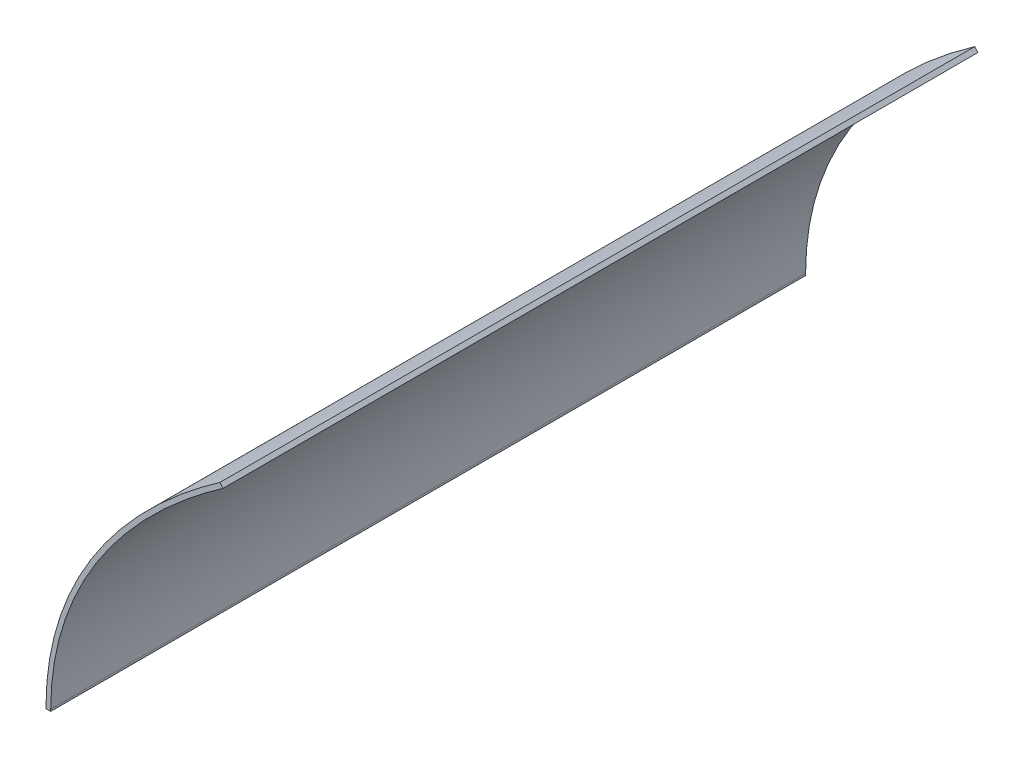
ISO-10303-21;
HEADER;
FILE_DESCRIPTION(('STEP AP214'),'2;1');
FILE_NAME('part.step','',(''),(''),'','','');
FILE_SCHEMA(('AUTOMOTIVE_DESIGN { 1 0 10303 214 1 1 1 1 }'));
ENDSEC;
DATA;
#1=APPLICATION_CONTEXT('core data for automotive mechanical design processes');
#2=APPLICATION_PROTOCOL_DEFINITION('international standard','automotive_design',2000,#1);
#3=PRODUCT_CONTEXT('',#1,'mechanical');
#4=PRODUCT('Part','Part','',(#3));
#5=PRODUCT_RELATED_PRODUCT_CATEGORY('part','',(#4));
#6=PRODUCT_DEFINITION_FORMATION('','',#4);
#7=PRODUCT_DEFINITION_CONTEXT('part definition',#1,'design');
#8=PRODUCT_DEFINITION('design','',#6,#7);
#9=PRODUCT_DEFINITION_SHAPE('','',#8);
#10=(LENGTH_UNIT() NAMED_UNIT(*) SI_UNIT(.MILLI.,.METRE.));
#11=(NAMED_UNIT(*) PLANE_ANGLE_UNIT() SI_UNIT($,.RADIAN.));
#12=(NAMED_UNIT(*) SI_UNIT($,.STERADIAN.) SOLID_ANGLE_UNIT());
#13=UNCERTAINTY_MEASURE_WITH_UNIT(LENGTH_MEASURE(1.E-05),#10,'distance_accuracy_value','');
#14=(GEOMETRIC_REPRESENTATION_CONTEXT(3) GLOBAL_UNCERTAINTY_ASSIGNED_CONTEXT((#13)) GLOBAL_UNIT_ASSIGNED_CONTEXT((#10,
#11,#12)) REPRESENTATION_CONTEXT('',''));
#15=CARTESIAN_POINT('',(0.,0.,0.));
#16=DIRECTION('',(0.,0.,1.));
#17=DIRECTION('',(1.,0.,0.));
#18=AXIS2_PLACEMENT_3D('',#15,#16,#17);
#19=CARTESIAN_POINT('',(-320.2,-39.4576678157257,0.));
#20=DIRECTION('',(1.,0.,0.));
#21=DIRECTION('',(0.,0.,-1.));
#22=AXIS2_PLACEMENT_3D('',#19,#20,#21);
#23=PLANE('',#22);
#24=DIRECTION('',(0.,1.,0.));
#25=VECTOR('',#24,1.);
#26=CARTESIAN_POINT('',(-320.2,-39.4576678157257,-40.));
#27=LINE('',#26,#25);
#28=CARTESIAN_POINT('',(-320.2,-39.6781588042974,-40.));
#29=VERTEX_POINT('',#28);
#30=CARTESIAN_POINT('',(-320.2,-39.4576678157257,-40.));
#31=VERTEX_POINT('',#30);
#32=EDGE_CURVE('E84',#29,#31,#27,.T.);
#33=ORIENTED_EDGE('',*,*,#32,.T.);
#34=DIRECTION('',(0.,0.,-1.));
#35=VECTOR('',#34,1.);
#36=CARTESIAN_POINT('',(-320.2,-39.4576678157257,0.));
#37=LINE('',#36,#35);
#38=CARTESIAN_POINT('',(-320.2,-39.4576678157257,40.));
#39=VERTEX_POINT('',#38);
#40=EDGE_CURVE('E126',#39,#31,#37,.T.);
#41=ORIENTED_EDGE('',*,*,#40,.F.);
#42=DIRECTION('',(0.,1.,0.));
#43=VECTOR('',#42,1.);
#44=CARTESIAN_POINT('',(-320.2,-39.4576678157257,40.));
#45=LINE('',#44,#43);
#46=CARTESIAN_POINT('',(-320.2,-39.6781588042974,40.));
#47=VERTEX_POINT('',#46);
#48=EDGE_CURVE('E69',#39,#47,#45,.F.);
#49=ORIENTED_EDGE('',*,*,#48,.T.);
#50=DIRECTION('',(0.,0.,-1.));
#51=VECTOR('',#50,1.);
#52=CARTESIAN_POINT('',(-320.2,-39.6781588042974,0.));
#53=LINE('',#52,#51);
#54=EDGE_CURVE('E129',#29,#47,#53,.F.);
#55=ORIENTED_EDGE('',*,*,#54,.F.);
#56=EDGE_LOOP('',(#33,#41,#49,#55));
#57=FACE_BOUND('',#56,.T.);
#58=ADVANCED_FACE('F16',(#57),#23,.T.);
#59=CARTESIAN_POINT('',(-320.2,-39.4576678157257,-40.));
#60=CARTESIAN_POINT('',(-320.2,-85.2653356314496,-40.));
#61=CARTESIAN_POINT('',(-241.755077106186,-85.26533563145,-40.));
#62=CARTESIAN_POINT('',(-163.310154212373,-85.2653356314504,-40.));
#63=CARTESIAN_POINT('',(-163.310154212372,-39.4576678157265,-40.));
#64=CARTESIAN_POINT('',(-163.310154212372,6.3499999999974,-40.));
#65=CARTESIAN_POINT('',(-241.755077106186,6.34999999999782,-40.));
#66=CARTESIAN_POINT('',(-320.2,6.34999999999822,-40.));
#67=CARTESIAN_POINT('',(-320.2,-39.4576678157257,-40.));
#68=CARTESIAN_POINT('',(-320.2,-39.4576678157257,40.));
#69=CARTESIAN_POINT('',(-320.2,-85.2653356314496,40.));
#70=CARTESIAN_POINT('',(-241.755077106186,-85.26533563145,40.));
#71=CARTESIAN_POINT('',(-163.310154212373,-85.2653356314504,40.));
#72=CARTESIAN_POINT('',(-163.310154212372,-39.4576678157265,40.));
#73=CARTESIAN_POINT('',(-163.310154212372,6.3499999999974,40.));
#74=CARTESIAN_POINT('',(-241.755077106186,6.34999999999782,40.));
#75=CARTESIAN_POINT('',(-320.2,6.34999999999822,40.));
#76=CARTESIAN_POINT('',(-320.2,-39.4576678157257,40.));
#77=(BOUNDED_SURFACE() B_SPLINE_SURFACE(1,2,((#59,#60,#61,#62,#63,#64,#65,#66,#67),(#68,#69,#70,
#71,#72,#73,#74,#75,#76)),.UNSPECIFIED.,.F.,.T.,.F.) B_SPLINE_SURFACE_WITH_KNOTS((2,2),(3,2,2,2,
3),(-0.509911904103031,0.509911904103031),(0.,123.220996737312,246.441993474623,
369.662990211935,492.883986949246),
.UNSPECIFIED.) GEOMETRIC_REPRESENTATION_ITEM() RATIONAL_B_SPLINE_SURFACE(((1.,0.707106781186548,
1.,0.707106781186548,1.,0.707106781186548,1.,0.707106781186548,1.),(1.,0.707106781186548,1.,
0.707106781186548,1.,0.707106781186548,1.,0.707106781186548,1.))) REPRESENTATION_ITEM('') SURFACE());
#78=CARTESIAN_POINT('',(-320.2,-39.4576678157257,-40.));
#79=CARTESIAN_POINT('',(-320.200001992337,-39.1844112710812,-40.));
#80=CARTESIAN_POINT('',(-320.195812234918,-38.9111722553848,-40.));
#81=CARTESIAN_POINT('',(-320.179072818182,-38.3649537047736,-40.));
#82=CARTESIAN_POINT('',(-320.166523261873,-38.0919741667031,-40.));
#83=CARTESIAN_POINT('',(-320.116402939818,-37.2742864870677,-40.));
#84=CARTESIAN_POINT('',(-320.066360416398,-36.7302922119212,-40.));
#85=CARTESIAN_POINT('',(-319.933563683254,-35.6465166187128,-40.));
#86=CARTESIAN_POINT('',(-319.850818885317,-35.1067341340282,-40.));
#87=CARTESIAN_POINT('',(-319.65485647069,-34.0404206264634,-40.));
#88=CARTESIAN_POINT('',(-319.54207425831,-33.5138094858131,-40.));
#89=CARTESIAN_POINT('',(-319.286639533193,-32.4678111790419,-40.));
#90=CARTESIAN_POINT('',(-319.143982261983,-31.9484251778058,-40.));
#91=CARTESIAN_POINT('',(-318.830128751372,-30.9183571387043,-40.));
#92=CARTESIAN_POINT('',(-318.658932019524,-30.4076752511954,-40.));
#93=CARTESIAN_POINT('',(-318.290120690814,-29.3979762876672,-40.));
#94=CARTESIAN_POINT('',(-318.092600066827,-28.8989248128179,-40.));
#95=CARTESIAN_POINT('',(-317.67224833539,-27.9116356233702,-40.));
#96=CARTESIAN_POINT('',(-317.449417963317,-27.4233975950787,-40.));
#97=CARTESIAN_POINT('',(-316.980047260997,-26.4584869818901,-40.));
#98=CARTESIAN_POINT('',(-316.733507354427,-25.9818141905191,-40.));
#99=CARTESIAN_POINT('',(-316.216371048529,-25.0370363744681,-40.));
#100=CARTESIAN_POINT('',(-315.945606997137,-24.5690232691788,-40.));
#101=CARTESIAN_POINT('',(-315.383243071798,-23.6457148713179,-40.));
#102=CARTESIAN_POINT('',(-315.091643482039,-23.1904194054011,-40.));
#103=CARTESIAN_POINT('',(-314.48916009879,-22.2928018067949,-40.));
#104=CARTESIAN_POINT('',(-314.178276298334,-21.8504796787926,-40.));
#105=CARTESIAN_POINT('',(-313.447928469511,-20.855248680115,-40.));
#106=CARTESIAN_POINT('',(-313.022685385304,-20.3065741094589,-40.));
#107=CARTESIAN_POINT('',(-312.145574528061,-19.230626042805,-40.));
#108=CARTESIAN_POINT('',(-311.693695718641,-18.7033615729834,-40.));
#109=CARTESIAN_POINT('',(-310.765768888456,-17.6698795445431,-40.));
#110=CARTESIAN_POINT('',(-310.289703240731,-17.1636778393313,-40.));
#111=CARTESIAN_POINT('',(-309.315793045927,-16.1720637105231,-40.));
#112=CARTESIAN_POINT('',(-308.817934386438,-15.6866651732835,-40.));
#113=CARTESIAN_POINT('',(-307.810573366755,-14.7437476522865,-40.));
#114=CARTESIAN_POINT('',(-307.30136142618,-14.2859178275346,-40.));
#115=CARTESIAN_POINT('',(-306.266285620308,-13.3900431945307,-40.));
#116=CARTESIAN_POINT('',(-305.740430148421,-12.9519886756497,-40.));
#117=CARTESIAN_POINT('',(-304.674274164163,-12.0955249579675,-40.));
#118=CARTESIAN_POINT('',(-304.133996338934,-11.6770874640828,-40.));
#119=CARTESIAN_POINT('',(-303.041157891734,-10.8597224408857,-40.));
#120=CARTESIAN_POINT('',(-302.488634626675,-10.4607449962774,-40.));
#121=CARTESIAN_POINT('',(-301.929970842398,-10.0706429067517,-40.));
#122=B_SPLINE_CURVE_WITH_KNOTS('',3,(#78,#79,#80,#81,#82,#83,#84,#85,#86,#87,#88,#89,#90,#91,
#92,#93,#94,#95,#96,#97,#98,#99,#100,#101,#102,#103,#104,#105,#106,#107,#108,#109,#110,#111,
#112,#113,#114,#115,#116,#117,#118,#119,#120,#121),.UNSPECIFIED.,.F.,.F.,(4,2,2,2,2,2,2,2,2,2,2,
2,2,2,2,2,2,2,2,2,2,4),(0.,0.819702712082179,1.63939532397697,3.27717207442907,4.91447781201449,
6.52923264478224,8.14424487008595,9.75928496517606,11.3687067421327,12.9780817691668,
14.5874280428937,16.208931128728,17.830412102183,19.4518936614372,21.5334721926057,
23.6159193628712,25.6999065864064,27.7852638926385,29.8390477164266,31.8918118122254,
33.9415177281154,35.9856551085407),.UNSPECIFIED.);
#123=CARTESIAN_POINT('',(-301.929970842398,-10.0706429067517,-40.));
#124=VERTEX_POINT('',#123);
#125=EDGE_CURVE('E86',#31,#124,#122,.T.);
#126=DIRECTION('',(0.,0.,1.));
#127=VECTOR('',#126,1.);
#128=CARTESIAN_POINT('',(-301.929970842398,-10.0706429067516,0.));
#129=LINE('',#128,#127);
#130=CARTESIAN_POINT('',(-301.929970842398,-10.0706429067517,40.));
#131=VERTEX_POINT('',#130);
#132=EDGE_CURVE('E87',#131,#124,#129,.F.);
#133=CARTESIAN_POINT('',(-320.2,-39.4576678157257,40.));
#134=CARTESIAN_POINT('',(-320.200001992337,-39.1844112710812,40.));
#135=CARTESIAN_POINT('',(-320.195812234918,-38.9111722553848,40.));
#136=CARTESIAN_POINT('',(-320.179072818182,-38.3649537047736,40.));
#137=CARTESIAN_POINT('',(-320.166523261873,-38.0919741667031,40.));
#138=CARTESIAN_POINT('',(-320.116402939818,-37.2742864870677,40.));
#139=CARTESIAN_POINT('',(-320.066360416398,-36.7302922119212,40.));
#140=CARTESIAN_POINT('',(-319.933563683254,-35.6465166187128,40.));
#141=CARTESIAN_POINT('',(-319.850818885317,-35.1067341340282,40.));
#142=CARTESIAN_POINT('',(-319.65485647069,-34.0404206264634,40.));
#143=CARTESIAN_POINT('',(-319.54207425831,-33.5138094858131,40.));
#144=CARTESIAN_POINT('',(-319.286639533193,-32.4678111790419,40.));
#145=CARTESIAN_POINT('',(-319.143982261983,-31.9484251778058,40.));
#146=CARTESIAN_POINT('',(-318.830128751372,-30.9183571387043,40.));
#147=CARTESIAN_POINT('',(-318.658932019524,-30.4076752511954,40.));
#148=CARTESIAN_POINT('',(-318.290120690814,-29.3979762876672,40.));
#149=CARTESIAN_POINT('',(-318.092600066827,-28.8989248128179,40.));
#150=CARTESIAN_POINT('',(-317.67224833539,-27.9116356233702,40.));
#151=CARTESIAN_POINT('',(-317.449417963317,-27.4233975950787,40.));
#152=CARTESIAN_POINT('',(-316.980047260997,-26.4584869818901,40.));
#153=CARTESIAN_POINT('',(-316.733507354427,-25.9818141905191,40.));
#154=CARTESIAN_POINT('',(-316.216371048529,-25.0370363744681,40.));
#155=CARTESIAN_POINT('',(-315.945606997137,-24.5690232691788,40.));
#156=CARTESIAN_POINT('',(-315.383243071798,-23.6457148713179,40.));
#157=CARTESIAN_POINT('',(-315.091643482039,-23.1904194054011,40.));
#158=CARTESIAN_POINT('',(-314.48916009879,-22.2928018067949,40.));
#159=CARTESIAN_POINT('',(-314.178276298334,-21.8504796787926,40.));
#160=CARTESIAN_POINT('',(-313.447928469511,-20.855248680115,40.));
#161=CARTESIAN_POINT('',(-313.022685385304,-20.3065741094589,40.));
#162=CARTESIAN_POINT('',(-312.145574528061,-19.230626042805,40.));
#163=CARTESIAN_POINT('',(-311.693695718641,-18.7033615729834,40.));
#164=CARTESIAN_POINT('',(-310.765768888456,-17.6698795445431,40.));
#165=CARTESIAN_POINT('',(-310.289703240731,-17.1636778393313,40.));
#166=CARTESIAN_POINT('',(-309.315793045927,-16.1720637105231,40.));
#167=CARTESIAN_POINT('',(-308.817934386438,-15.6866651732834,40.));
#168=CARTESIAN_POINT('',(-307.810573366755,-14.7437476522865,40.));
#169=CARTESIAN_POINT('',(-307.30136142618,-14.2859178275346,40.));
#170=CARTESIAN_POINT('',(-306.266285620308,-13.3900431945307,40.));
#171=CARTESIAN_POINT('',(-305.740430148421,-12.9519886756497,40.));
#172=CARTESIAN_POINT('',(-304.674274164163,-12.0955249579675,40.));
#173=CARTESIAN_POINT('',(-304.133996338934,-11.6770874640828,40.));
#174=CARTESIAN_POINT('',(-303.041157891734,-10.8597224408857,40.));
#175=CARTESIAN_POINT('',(-302.488634626675,-10.4607449962773,40.));
#176=CARTESIAN_POINT('',(-301.929970842398,-10.0706429067516,40.));
#177=B_SPLINE_CURVE_WITH_KNOTS('',3,(#133,#134,#135,#136,#137,#138,#139,#140,#141,#142,#143,
#144,#145,#146,#147,#148,#149,#150,#151,#152,#153,#154,#155,#156,#157,#158,#159,#160,#161,#162,
#163,#164,#165,#166,#167,#168,#169,#170,#171,#172,#173,#174,#175,#176),.UNSPECIFIED.,.F.,.F.,(4,
2,2,2,2,2,2,2,2,2,2,2,2,2,2,2,2,2,2,2,2,4),(0.,0.819702712082179,1.63939532397697,
3.27717207442907,4.91447781201449,6.52923264478223,8.14424487008594,9.75928496517606,
11.3687067421327,12.9780817691668,14.5874280428937,16.208931128728,17.830412102183,
19.4518936614372,21.5334721926057,23.6159193628712,25.6999065864064,27.7852638926385,
29.8390477164266,31.8918118122253,33.9415177281154,35.9856551085407),.UNSPECIFIED.);
#178=EDGE_CURVE('E23',#39,#131,#177,.T.);
#179=CARTESIAN_POINT('',(-163.310154212372,-39.4576678157265,-40.));
#180=CARTESIAN_POINT('',(-163.310154212372,6.3499999999974,-40.));
#181=CARTESIAN_POINT('',(-241.755077106186,6.34999999999782,-40.));
#182=CARTESIAN_POINT('',(-320.2,6.34999999999822,-40.));
#183=CARTESIAN_POINT('',(-320.2,-39.4576678157257,-40.));
#184=CARTESIAN_POINT('',(-320.2,-85.2653356314496,-40.));
#185=CARTESIAN_POINT('',(-241.755077106186,-85.26533563145,-40.));
#186=CARTESIAN_POINT('',(-163.310154212373,-85.2653356314504,-40.));
#187=CARTESIAN_POINT('',(-163.310154212372,-39.4576678157265,-40.));
#188=CARTESIAN_POINT('',(-163.310154212372,-39.4576678157265,40.));
#189=CARTESIAN_POINT('',(-163.310154212372,6.3499999999974,40.));
#190=CARTESIAN_POINT('',(-241.755077106186,6.34999999999782,40.));
#191=CARTESIAN_POINT('',(-320.2,6.34999999999822,40.));
#192=CARTESIAN_POINT('',(-320.2,-39.4576678157257,40.));
#193=CARTESIAN_POINT('',(-320.2,-85.2653356314496,40.));
#194=CARTESIAN_POINT('',(-241.755077106186,-85.26533563145,40.));
#195=CARTESIAN_POINT('',(-163.310154212373,-85.2653356314504,40.));
#196=CARTESIAN_POINT('',(-163.310154212372,-39.4576678157265,40.));
#197=(BOUNDED_SURFACE() B_SPLINE_SURFACE(1,2,((#179,#180,#181,#182,#183,#184,#185,#186,#187),
(#188,#189,#190,#191,#192,#193,#194,#195,#196)),.UNSPECIFIED.,.F.,.T.,
.F.) B_SPLINE_SURFACE_WITH_KNOTS((2,2),(3,2,2,2,3),(-0.509911904103031,0.509911904103031),
(246.441993474623,369.662990211935,492.883986949246,616.104983686558,739.325980423869),
.UNSPECIFIED.) GEOMETRIC_REPRESENTATION_ITEM() RATIONAL_B_SPLINE_SURFACE(((1.,0.707106781186548,
1.,0.707106781186548,1.,0.707106781186548,1.,0.707106781186548,1.),(1.,0.707106781186548,1.,
0.707106781186548,1.,0.707106781186548,1.,0.707106781186548,1.))) REPRESENTATION_ITEM('') SURFACE());
#198=ORIENTED_EDGE('',*,*,#125,.T.);
#199=ORIENTED_EDGE('',*,*,#132,.F.);
#200=ORIENTED_EDGE('',*,*,#178,.F.);
#201=ORIENTED_EDGE('',*,*,#40,.T.);
#202=EDGE_LOOP('',(#198,#199,#200,#201));
#203=FACE_BOUND('',#202,.T.);
#204=ADVANCED_FACE('F156',(#203),#197,.T.);
#205=CARTESIAN_POINT('',(-320.2,-39.6781588042974,0.));
#206=DIRECTION('',(0.,-1.,0.));
#207=DIRECTION('',(0.,0.,-1.));
#208=AXIS2_PLACEMENT_3D('',#205,#206,#207);
#209=PLANE('',#208);
#210=DIRECTION('',(1.,0.,0.));
#211=VECTOR('',#210,1.);
#212=CARTESIAN_POINT('',(-313.936621218643,-39.6781588042974,-40.));
#213=LINE('',#212,#211);
#214=CARTESIAN_POINT('',(-320.7,-39.6781588042974,-40.));
#215=VERTEX_POINT('',#214);
#216=EDGE_CURVE('E80',#215,#29,#213,.T.);
#217=ORIENTED_EDGE('',*,*,#216,.T.);
#218=ORIENTED_EDGE('',*,*,#54,.T.);
#219=DIRECTION('',(1.,0.,0.));
#220=VECTOR('',#219,1.);
#221=CARTESIAN_POINT('',(-313.936621218643,-39.6781588042974,40.));
#222=LINE('',#221,#220);
#223=CARTESIAN_POINT('',(-320.7,-39.6781588042974,40.));
#224=VERTEX_POINT('',#223);
#225=EDGE_CURVE('E92',#224,#47,#222,.T.);
#226=ORIENTED_EDGE('',*,*,#225,.F.);
#227=DIRECTION('',(0.,0.,1.));
#228=VECTOR('',#227,1.);
#229=CARTESIAN_POINT('',(-320.7,-39.6781588042974,0.));
#230=LINE('',#229,#228);
#231=EDGE_CURVE('E90',#215,#224,#230,.T.);
#232=ORIENTED_EDGE('',*,*,#231,.F.);
#233=EDGE_LOOP('',(#217,#218,#226,#232));
#234=FACE_BOUND('',#233,.T.);
#235=ADVANCED_FACE('F91',(#234),#209,.T.);
#236=CARTESIAN_POINT('',(-313.936621218643,-24.1954761185131,40.));
#237=DIRECTION('',(0.,0.,1.));
#238=DIRECTION('',(1.,0.,0.));
#239=AXIS2_PLACEMENT_3D('',#236,#237,#238);
#240=PLANE('',#239);
#241=DIRECTION('',(3.222548E-13,-1.,0.));
#242=VECTOR('',#241,1.);
#243=CARTESIAN_POINT('',(-320.7,-39.6781588042974,40.));
#244=LINE('',#243,#242);
#245=CARTESIAN_POINT('',(-320.7,-39.4576678157255,40.));
#246=VERTEX_POINT('',#245);
#247=EDGE_CURVE('E100',#224,#246,#244,.F.);
#248=ORIENTED_EDGE('',*,*,#247,.F.);
#249=ORIENTED_EDGE('',*,*,#225,.T.);
#250=ORIENTED_EDGE('',*,*,#48,.F.);
#251=ORIENTED_EDGE('',*,*,#178,.T.);
#252=DIRECTION('',(-0.694182373124195,0.719799161463572,0.));
#253=VECTOR('',#252,1.);
#254=CARTESIAN_POINT('',(-302.281390981782,-9.70625462574186,40.));
#255=LINE('',#254,#253);
#256=CARTESIAN_POINT('',(-302.281390981782,-9.70625462574186,40.));
#257=VERTEX_POINT('',#256);
#258=EDGE_CURVE('E112',#257,#131,#255,.F.);
#259=ORIENTED_EDGE('',*,*,#258,.F.);
#260=CARTESIAN_POINT('',(-320.7,-39.4576678157255,40.));
#261=CARTESIAN_POINT('',(-320.70000082067,-39.1796688679994,40.));
#262=CARTESIAN_POINT('',(-320.695743545062,-38.9016877096724,40.));
#263=CARTESIAN_POINT('',(-320.678735753804,-38.3459885645037,40.));
#264=CARTESIAN_POINT('',(-320.665985339171,-38.0682705745713,40.));
#265=CARTESIAN_POINT('',(-320.615061434067,-37.2363781737143,40.));
#266=CARTESIAN_POINT('',(-320.564215179838,-36.6829281065152,40.));
#267=CARTESIAN_POINT('',(-320.429273690024,-35.580302230755,40.));
#268=CARTESIAN_POINT('',(-320.345187848853,-35.03112525918,40.));
#269=CARTESIAN_POINT('',(-320.146022012451,-33.9461730859275,40.));
#270=CARTESIAN_POINT('',(-320.031380645478,-33.410317268913,40.));
#271=CARTESIAN_POINT('',(-319.771698119372,-32.3459528335052,40.));
#272=CARTESIAN_POINT('',(-319.626652230309,-31.8174453719278,40.));
#273=CARTESIAN_POINT('',(-319.307515880398,-30.7692826730409,40.));
#274=CARTESIAN_POINT('',(-319.133424956593,-30.2496275769769,40.));
#275=CARTESIAN_POINT('',(-318.758308844867,-29.2221517678434,40.));
#276=CARTESIAN_POINT('',(-318.557377107078,-28.7142968660908,40.));
#277=CARTESIAN_POINT('',(-318.129715596561,-27.709605674251,40.));
#278=CARTESIAN_POINT('',(-317.902986536325,-27.2127690803047,40.));
#279=CARTESIAN_POINT('',(-317.425348715403,-26.2308904226173,40.));
#280=CARTESIAN_POINT('',(-317.17444039006,-25.7458481467187,40.));
#281=CARTESIAN_POINT('',(-316.648104295949,-24.7845749483658,40.));
#282=CARTESIAN_POINT('',(-316.372507866623,-24.3084365273091,40.));
#283=CARTESIAN_POINT('',(-315.800055483979,-23.3691437982767,40.));
#284=CARTESIAN_POINT('',(-315.503199808778,-22.9059893205538,40.));
#285=CARTESIAN_POINT('',(-314.889797343977,-21.9929383157657,40.));
#286=CARTESIAN_POINT('',(-314.573250535904,-21.543041801139,40.));
#287=CARTESIAN_POINT('',(-313.835276819687,-20.5386623898595,40.));
#288=CARTESIAN_POINT('',(-313.408357450159,-19.9882094869393,40.));
#289=CARTESIAN_POINT('',(-312.528035237053,-18.9086046156818,40.));
#290=CARTESIAN_POINT('',(-312.074621820007,-18.3794612960345,40.));
#291=CARTESIAN_POINT('',(-311.143712626753,-17.3421524612399,40.));
#292=CARTESIAN_POINT('',(-310.666199850257,-16.8340022279734,40.));
#293=CARTESIAN_POINT('',(-309.689453391114,-15.8384271843425,40.));
#294=CARTESIAN_POINT('',(-309.19020604583,-15.351015802692,40.));
#295=CARTESIAN_POINT('',(-308.179909451101,-14.4038800076064,40.));
#296=CARTESIAN_POINT('',(-307.669143336458,-13.9438530337038,40.));
#297=CARTESIAN_POINT('',(-306.630935230518,-13.0435586538731,40.));
#298=CARTESIAN_POINT('',(-306.10350135694,-12.6032818742733,40.));
#299=CARTESIAN_POINT('',(-305.034133096633,-11.7423572581719,40.));
#300=CARTESIAN_POINT('',(-304.492220757945,-11.3216819845978,40.));
#301=CARTESIAN_POINT('',(-303.396033416845,-10.4998260992292,40.));
#302=CARTESIAN_POINT('',(-302.841794805165,-10.0985969802601,40.));
#303=CARTESIAN_POINT('',(-302.281390981782,-9.70625462574186,40.));
#304=B_SPLINE_CURVE_WITH_KNOTS('',3,(#260,#261,#262,#263,#264,#265,#266,#267,#268,#269,#270,
#271,#272,#273,#274,#275,#276,#277,#278,#279,#280,#281,#282,#283,#284,#285,#286,#287,#288,#289,
#290,#291,#292,#293,#294,#295,#296,#297,#298,#299,#300,#301,#302,#303),.UNSPECIFIED.,.F.,.F.,(4,
2,2,2,2,2,2,2,2,2,2,2,2,2,2,2,2,2,2,2,2,4),(0.,0.833928963603781,1.66784800877383,
3.33407714806251,4.9998357018692,6.64286210706169,8.28614430228706,9.92945269268242,
11.5671819501144,13.2048659864972,14.8425205422097,16.4923690637028,18.1421960056417,
19.7920244953912,21.8809165487384,23.970648025328,26.0618748366977,28.1544357582599,
30.2160967734422,32.2767687175467,34.3344638260328,36.3867298111303),.UNSPECIFIED.);
#305=EDGE_CURVE('E96',#246,#257,#304,.T.);
#306=ORIENTED_EDGE('',*,*,#305,.F.);
#307=EDGE_LOOP('',(#248,#249,#250,#251,#259,#306));
#308=FACE_BOUND('',#307,.T.);
#309=ADVANCED_FACE('F180',(#308),#240,.T.);
#310=CARTESIAN_POINT('',(-302.281390981782,-9.70625462574186,0.));
#311=DIRECTION('',(0.719799161463572,0.694182373124195,0.));
#312=DIRECTION('',(-0.694182373124195,0.719799161463572,0.));
#313=AXIS2_PLACEMENT_3D('',#310,#311,#312);
#314=PLANE('',#313);
#315=DIRECTION('',(-0.69418237312418,0.719799161463586,0.));
#316=VECTOR('',#315,1.);
#317=CARTESIAN_POINT('',(-301.929970842398,-10.0706429067517,-40.));
#318=LINE('',#317,#316);
#319=CARTESIAN_POINT('',(-302.281390981782,-9.70625462574186,-40.));
#320=VERTEX_POINT('',#319);
#321=EDGE_CURVE('E102',#124,#320,#318,.T.);
#322=ORIENTED_EDGE('',*,*,#321,.T.);
#323=DIRECTION('',(0.,0.,-1.));
#324=VECTOR('',#323,1.);
#325=CARTESIAN_POINT('',(-302.281390981782,-9.70625462574186,0.));
#326=LINE('',#325,#324);
#327=EDGE_CURVE('E108',#257,#320,#326,.T.);
#328=ORIENTED_EDGE('',*,*,#327,.F.);
#329=ORIENTED_EDGE('',*,*,#258,.T.);
#330=ORIENTED_EDGE('',*,*,#132,.T.);
#331=EDGE_LOOP('',(#322,#328,#329,#330));
#332=FACE_BOUND('',#331,.T.);
#333=ADVANCED_FACE('F151',(#332),#314,.T.);
#334=CARTESIAN_POINT('',(-313.936621218643,-24.1954761185131,-40.));
#335=DIRECTION('',(0.,0.,1.));
#336=DIRECTION('',(1.,0.,0.));
#337=AXIS2_PLACEMENT_3D('',#334,#335,#336);
#338=PLANE('',#337);
#339=ORIENTED_EDGE('',*,*,#125,.F.);
#340=ORIENTED_EDGE('',*,*,#32,.F.);
#341=ORIENTED_EDGE('',*,*,#216,.F.);
#342=DIRECTION('',(3.222548E-13,-1.,0.));
#343=VECTOR('',#342,1.);
#344=CARTESIAN_POINT('',(-320.7,-39.6781588042974,-40.));
#345=LINE('',#344,#343);
#346=CARTESIAN_POINT('',(-320.7,-39.4576678157255,-40.));
#347=VERTEX_POINT('',#346);
#348=EDGE_CURVE('E43',#347,#215,#345,.T.);
#349=ORIENTED_EDGE('',*,*,#348,.F.);
#350=CARTESIAN_POINT('',(-302.281390981782,-9.70625462574186,-40.));
#351=CARTESIAN_POINT('',(-302.887287708201,-10.1304506593116,-40.));
#352=CARTESIAN_POINT('',(-303.485987824961,-10.5650373160159,-40.));
#353=CARTESIAN_POINT('',(-304.669324173606,-11.4572728107937,-40.));
#354=CARTESIAN_POINT('',(-305.253901977224,-11.9149990829197,-40.));
#355=CARTESIAN_POINT('',(-306.406071618788,-12.853677391434,-40.));
#356=CARTESIAN_POINT('',(-306.973627523013,-13.3346736311592,-40.));
#357=CARTESIAN_POINT('',(-308.088784339758,-14.3200365655343,-40.));
#358=CARTESIAN_POINT('',(-308.636371674075,-14.824418651542,-40.));
#359=CARTESIAN_POINT('',(-309.716118544122,-15.8638937840233,-40.));
#360=CARTESIAN_POINT('',(-310.247965856276,-16.3993118376631,-40.));
#361=CARTESIAN_POINT('',(-311.28503895157,-17.4944927283752,-40.));
#362=CARTESIAN_POINT('',(-311.79028790132,-18.0542335781963,-40.));
#363=CARTESIAN_POINT('',(-312.771034329982,-19.1982530911763,-40.));
#364=CARTESIAN_POINT('',(-313.246561647375,-19.7825061276361,-40.));
#365=CARTESIAN_POINT('',(-314.164722167362,-20.975833840268,-40.));
#366=CARTESIAN_POINT('',(-314.607375969621,-21.5848925953857,-40.));
#367=CARTESIAN_POINT('',(-315.308895039751,-22.612043831888,-40.));
#368=CARTESIAN_POINT('',(-315.578214359601,-23.0230259042373,-40.));
#369=CARTESIAN_POINT('',(-316.10025663368,-23.8554248700176,-40.));
#370=CARTESIAN_POINT('',(-316.352979630229,-24.2768417368367,-40.));
#371=CARTESIAN_POINT('',(-316.840663395219,-25.1298376642149,-40.));
#372=CARTESIAN_POINT('',(-317.075624270748,-25.5614166634849,-40.));
#373=CARTESIAN_POINT('',(-317.525113029632,-26.4314783123535,-40.));
#374=CARTESIAN_POINT('',(-317.739766041663,-26.8698962300175,-40.));
#375=CARTESIAN_POINT('',(-318.14923878726,-27.755929130198,-40.));
#376=CARTESIAN_POINT('',(-318.344057908716,-28.2035443960494,-40.));
#377=CARTESIAN_POINT('',(-318.712712712027,-29.1073841074441,-40.));
#378=CARTESIAN_POINT('',(-318.886546739353,-29.5636092285397,-40.));
#379=CARTESIAN_POINT('',(-319.226455729674,-30.5244675355922,-40.));
#380=CARTESIAN_POINT('',(-319.390496261598,-31.0298230758901,-40.));
#381=CARTESIAN_POINT('',(-319.691076804097,-32.0486756909456,-40.));
#382=CARTESIAN_POINT('',(-319.827615981018,-32.5621730119975,-40.));
#383=CARTESIAN_POINT('',(-320.071970590703,-33.5959107303913,-40.));
#384=CARTESIAN_POINT('',(-320.179789359722,-34.1161503371588,-40.));
#385=CARTESIAN_POINT('',(-320.36695202448,-35.1687045577346,-40.));
#386=CARTESIAN_POINT('',(-320.445907864025,-35.7010882417875,-40.));
#387=CARTESIAN_POINT('',(-320.57258791866,-36.7697253018211,-40.));
#388=CARTESIAN_POINT('',(-320.620304925931,-37.3059795420289,-40.));
#389=CARTESIAN_POINT('',(-320.66808822223,-38.1118993214612,-40.));
#390=CARTESIAN_POINT('',(-320.680050637748,-38.3809064202917,-40.));
#391=CARTESIAN_POINT('',(-320.696006956699,-38.919159552165,-40.));
#392=CARTESIAN_POINT('',(-320.700000777844,-39.1884055876463,-40.));
#393=CARTESIAN_POINT('',(-320.7,-39.4576678157255,-40.));
#394=B_SPLINE_CURVE_WITH_KNOTS('',3,(#350,#351,#352,#353,#354,#355,#356,#357,#358,#359,#360,
#361,#362,#363,#364,#365,#366,#367,#368,#369,#370,#371,#372,#373,#374,#375,#376,#377,#378,#379,
#380,#381,#382,#383,#384,#385,#386,#387,#388,#389,#390,#391,#392,#393),.UNSPECIFIED.,.F.,.F.,(4,
2,2,2,2,2,2,2,2,2,2,2,2,2,2,2,2,2,2,2,2,4),(0.,2.21887817027118,4.44574902673601,
6.67703020999779,8.90980135167244,11.1730208736865,13.4342354094034,15.6931421172385,
17.9506211594906,19.4243698371409,20.8981147566812,22.3718507901681,23.8358171375307,
25.2998286518739,26.7639555180596,28.3571339482,29.9503606653836,31.5434022274741,
33.1571360873645,34.7712421572316,35.5789587529198,36.3866836893843),.UNSPECIFIED.);
#395=EDGE_CURVE('E34',#320,#347,#394,.T.);
#396=ORIENTED_EDGE('',*,*,#395,.F.);
#397=ORIENTED_EDGE('',*,*,#321,.F.);
#398=EDGE_LOOP('',(#339,#340,#341,#349,#396,#397));
#399=FACE_BOUND('',#398,.T.);
#400=ADVANCED_FACE('F83',(#399),#338,.F.);
#401=CARTESIAN_POINT('',(-320.7,-39.6781588042974,0.));
#402=DIRECTION('',(-1.,-3.222548E-13,0.));
#403=DIRECTION('',(3.222548E-13,-1.,0.));
#404=AXIS2_PLACEMENT_3D('',#401,#402,#403);
#405=PLANE('',#404);
#406=ORIENTED_EDGE('',*,*,#348,.T.);
#407=ORIENTED_EDGE('',*,*,#231,.T.);
#408=ORIENTED_EDGE('',*,*,#247,.T.);
#409=DIRECTION('',(0.,0.,1.));
#410=VECTOR('',#409,1.);
#411=CARTESIAN_POINT('',(-320.7,-39.4576678157255,0.));
#412=LINE('',#411,#410);
#413=EDGE_CURVE('E10',#347,#246,#412,.T.);
#414=ORIENTED_EDGE('',*,*,#413,.F.);
#415=EDGE_LOOP('',(#406,#407,#408,#414));
#416=FACE_BOUND('',#415,.T.);
#417=ADVANCED_FACE('F98',(#416),#405,.T.);
#418=CARTESIAN_POINT('',(-302.281390981782,-9.70625462574186,-40.));
#419=CARTESIAN_POINT('',(-302.281390981782,-9.70625462574186,40.));
#420=CARTESIAN_POINT('',(-303.259287437323,-10.3908507842879,-40.));
#421=CARTESIAN_POINT('',(-303.259287437323,-10.3908507842879,40.));
#422=CARTESIAN_POINT('',(-305.147842979813,-11.7936199939543,-40.));
#423=CARTESIAN_POINT('',(-305.147842979813,-11.7936199939543,40.));
#424=CARTESIAN_POINT('',(-307.332474456625,-13.6254392569379,-40.));
#425=CARTESIAN_POINT('',(-307.332474456625,-13.6254392569379,40.));
#426=CARTESIAN_POINT('',(-309.379511568257,-15.5116441504095,-40.));
#427=CARTESIAN_POINT('',(-309.379511568257,-15.5116441504095,40.));
#428=CARTESIAN_POINT('',(-310.904957222638,-17.0623153833498,-40.));
#429=CARTESIAN_POINT('',(-310.904957222638,-17.0623153833498,40.));
#430=CARTESIAN_POINT('',(-312.666586230492,-19.0481480488164,-40.));
#431=CARTESIAN_POINT('',(-312.666586230492,-19.0481480488164,40.));
#432=CARTESIAN_POINT('',(-313.957890427965,-20.6729009494256,-40.));
#433=CARTESIAN_POINT('',(-313.957890427965,-20.6729009494256,40.));
#434=CARTESIAN_POINT('',(-315.420203589333,-22.7440376867978,-40.));
#435=CARTESIAN_POINT('',(-315.420203589333,-22.7440376867978,40.));
#436=CARTESIAN_POINT('',(-316.466999953108,-24.4310824137415,-40.));
#437=CARTESIAN_POINT('',(-316.466999953108,-24.4310824137415,40.));
#438=CARTESIAN_POINT('',(-317.618022158335,-26.5723435198734,-40.));
#439=CARTESIAN_POINT('',(-317.618022158335,-26.5723435198734,40.));
#440=CARTESIAN_POINT('',(-318.411534345552,-28.3091668988872,-40.));
#441=CARTESIAN_POINT('',(-318.411534345552,-28.3091668988872,40.));
#442=CARTESIAN_POINT('',(-319.241368035035,-30.5044139845685,-40.));
#443=CARTESIAN_POINT('',(-319.241368035035,-30.5044139845685,40.));
#444=CARTESIAN_POINT('',(-319.774574060034,-32.2776942228104,-40.));
#445=CARTESIAN_POINT('',(-319.774574060034,-32.2776942228104,40.));
#446=CARTESIAN_POINT('',(-320.275675524015,-34.5097559530607,-40.));
#447=CARTESIAN_POINT('',(-320.275675524015,-34.5097559530607,40.));
#448=CARTESIAN_POINT('',(-320.610569313294,-36.7542479293374,-40.));
#449=CARTESIAN_POINT('',(-320.610569313294,-36.7542479293374,40.));
#450=CARTESIAN_POINT('',(-320.7,-38.5565280775742,-40.));
#451=CARTESIAN_POINT('',(-320.7,-38.5565280775742,40.));
#452=CARTESIAN_POINT('',(-320.7,-39.4576678157255,-40.));
#453=CARTESIAN_POINT('',(-320.7,-39.4576678157255,40.));
#454=B_SPLINE_SURFACE_WITH_KNOTS('',3,1,((#418,#419),(#420,#421),(#422,#423),(#424,#425),(#426,
#427),(#428,#429),(#430,#431),(#432,#433),(#434,#435),(#436,#437),(#438,#439),(#440,#441),(#442,
#443),(#444,#445),(#446,#447),(#448,#449),(#450,#451),(#452,#453)),.UNSPECIFIED.,.F.,.F.,.F.,(4,
1,1,1,1,1,1,1,1,1,1,1,1,1,1,4),(2,2),(5.58797930077618,5.64591313464314,5.70384696851008,
5.73281388544356,5.79074771931051,5.81971463624398,5.87764847011093,5.90661538704441,
5.96454922091136,5.99351613784484,6.05144997171179,6.08041688864526,6.13835072251221,
6.16731763944569,6.22525147331264,6.28318530717959),(-4.,4.),.UNSPECIFIED.);
#455=ORIENTED_EDGE('',*,*,#413,.T.);
#456=ORIENTED_EDGE('',*,*,#305,.T.);
#457=ORIENTED_EDGE('',*,*,#327,.T.);
#458=ORIENTED_EDGE('',*,*,#395,.T.);
#459=EDGE_LOOP('',(#455,#456,#457,#458));
#460=FACE_BOUND('',#459,.T.);
#461=ADVANCED_FACE('F18',(#460),#454,.T.);
#462=CLOSED_SHELL('',(#58,#204,#235,#309,#333,#400,#417,#461));
#463=MANIFOLD_SOLID_BREP('B1',#462);
#464=ADVANCED_BREP_SHAPE_REPRESENTATION('',(#18,#463),#14);
#465=SHAPE_DEFINITION_REPRESENTATION(#9,#464);
ENDSEC;
END-ISO-10303-21;
